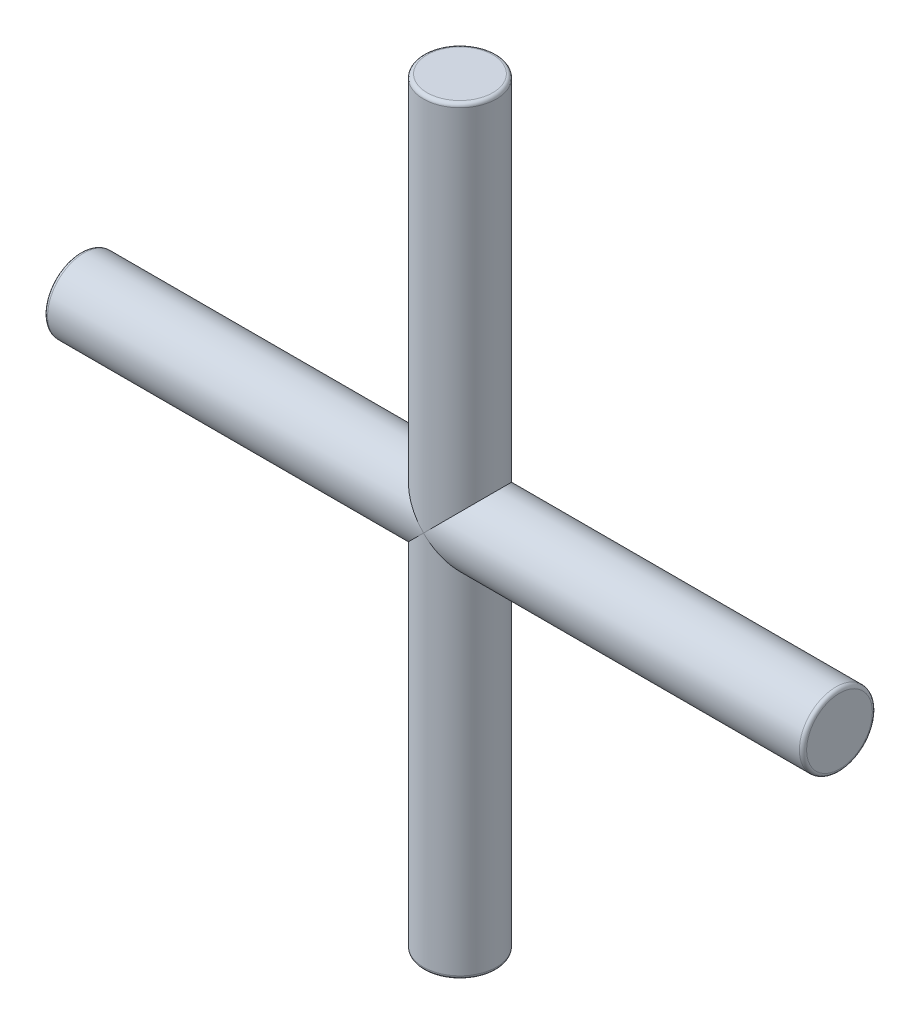
ISO-10303-21;
HEADER;
FILE_DESCRIPTION(('STEP AP214'),'2;1');
FILE_NAME('part.step','',(''),(''),'','','');
FILE_SCHEMA(('AUTOMOTIVE_DESIGN { 1 0 10303 214 1 1 1 1 }'));
ENDSEC;
DATA;
#1=APPLICATION_CONTEXT('core data for automotive mechanical design processes');
#2=APPLICATION_PROTOCOL_DEFINITION('international standard','automotive_design',2000,#1);
#3=PRODUCT_CONTEXT('',#1,'mechanical');
#4=PRODUCT('Part','Part','',(#3));
#5=PRODUCT_RELATED_PRODUCT_CATEGORY('part','',(#4));
#6=PRODUCT_DEFINITION_FORMATION('','',#4);
#7=PRODUCT_DEFINITION_CONTEXT('part definition',#1,'design');
#8=PRODUCT_DEFINITION('design','',#6,#7);
#9=PRODUCT_DEFINITION_SHAPE('','',#8);
#10=(LENGTH_UNIT() NAMED_UNIT(*) SI_UNIT(.MILLI.,.METRE.));
#11=(NAMED_UNIT(*) PLANE_ANGLE_UNIT() SI_UNIT($,.RADIAN.));
#12=(NAMED_UNIT(*) SI_UNIT($,.STERADIAN.) SOLID_ANGLE_UNIT());
#13=UNCERTAINTY_MEASURE_WITH_UNIT(LENGTH_MEASURE(1.E-05),#10,'distance_accuracy_value','');
#14=(GEOMETRIC_REPRESENTATION_CONTEXT(3) GLOBAL_UNCERTAINTY_ASSIGNED_CONTEXT((#13)) GLOBAL_UNIT_ASSIGNED_CONTEXT((#10,
#11,#12)) REPRESENTATION_CONTEXT('',''));
#15=CARTESIAN_POINT('',(0.,0.,0.));
#16=DIRECTION('',(0.,0.,1.));
#17=DIRECTION('',(1.,0.,0.));
#18=AXIS2_PLACEMENT_3D('',#15,#16,#17);
#19=CARTESIAN_POINT('',(26000.,0.,0.));
#20=DIRECTION('',(-1.,0.,0.));
#21=DIRECTION('',(0.,0.,1.));
#22=AXIS2_PLACEMENT_3D('',#19,#20,#21);
#23=CYLINDRICAL_SURFACE('',#22,2500.);
#24=CARTESIAN_POINT('',(25750.,0.,0.));
#25=DIRECTION('',(1.,0.,0.));
#26=DIRECTION('',(0.,0.,-1.));
#27=AXIS2_PLACEMENT_3D('',#24,#25,#26);
#28=CIRCLE('',#27,2500.);
#29=CARTESIAN_POINT('',(25750.,0.,-2500.));
#30=VERTEX_POINT('',#29);
#31=EDGE_CURVE('E72',#30,#30,#28,.F.);
#32=ORIENTED_EDGE('',*,*,#31,.T.);
#33=EDGE_LOOP('',(#32));
#34=FACE_BOUND('',#33,.T.);
#35=CARTESIAN_POINT('',(0.,0.,0.));
#36=DIRECTION('',(-0.707106781186547,-0.707106781186547,0.));
#37=DIRECTION('',(-0.707106781186547,0.707106781186547,0.));
#38=AXIS2_PLACEMENT_3D('',#35,#36,#37);
#39=ELLIPSE('',#38,3535.53390593274,2500.);
#40=CARTESIAN_POINT('',(0.,0.,-2500.));
#41=VERTEX_POINT('',#40);
#42=CARTESIAN_POINT('',(0.,0.,2500.));
#43=VERTEX_POINT('',#42);
#44=EDGE_CURVE('E58',#41,#43,#39,.T.);
#45=ORIENTED_EDGE('',*,*,#44,.F.);
#46=CARTESIAN_POINT('',(0.,0.,0.));
#47=DIRECTION('',(-0.707106781186547,0.707106781186547,0.));
#48=DIRECTION('',(-0.707106781186547,-0.707106781186547,0.));
#49=AXIS2_PLACEMENT_3D('',#46,#47,#48);
#50=ELLIPSE('',#49,3535.53390593274,2500.);
#51=EDGE_CURVE('E57',#43,#41,#50,.T.);
#52=ORIENTED_EDGE('',*,*,#51,.F.);
#53=EDGE_LOOP('',(#45,#52));
#54=FACE_BOUND('',#53,.T.);
#55=ADVANCED_FACE('F37',(#34,#54),#23,.T.);
#56=CARTESIAN_POINT('',(26000.,0.,0.));
#57=DIRECTION('',(1.,0.,0.));
#58=DIRECTION('',(0.,0.,-1.));
#59=AXIS2_PLACEMENT_3D('',#56,#57,#58);
#60=PLANE('',#59);
#61=CARTESIAN_POINT('',(26000.,0.,0.));
#62=DIRECTION('',(1.,0.,0.));
#63=DIRECTION('',(0.,0.,-1.));
#64=AXIS2_PLACEMENT_3D('',#61,#62,#63);
#65=CIRCLE('',#64,2250.);
#66=CARTESIAN_POINT('',(26000.,0.,-2250.));
#67=VERTEX_POINT('',#66);
#68=EDGE_CURVE('E69',#67,#67,#65,.T.);
#69=ORIENTED_EDGE('',*,*,#68,.T.);
#70=EDGE_LOOP('',(#69));
#71=FACE_BOUND('',#70,.T.);
#72=ADVANCED_FACE('F103',(#71),#60,.T.);
#73=CARTESIAN_POINT('',(0.,-26000.,0.));
#74=DIRECTION('',(0.,1.,0.));
#75=DIRECTION('',(0.,0.,1.));
#76=AXIS2_PLACEMENT_3D('',#73,#74,#75);
#77=PLANE('',#76);
#78=CARTESIAN_POINT('',(0.,-26000.,0.));
#79=DIRECTION('',(0.,1.,0.));
#80=DIRECTION('',(0.,0.,1.));
#81=AXIS2_PLACEMENT_3D('',#78,#79,#80);
#82=CIRCLE('',#81,2250.);
#83=CARTESIAN_POINT('',(0.,-26000.,2250.));
#84=VERTEX_POINT('',#83);
#85=EDGE_CURVE('E86',#84,#84,#82,.F.);
#86=ORIENTED_EDGE('',*,*,#85,.T.);
#87=EDGE_LOOP('',(#86));
#88=FACE_BOUND('',#87,.T.);
#89=ADVANCED_FACE('F109',(#88),#77,.F.);
#90=CARTESIAN_POINT('',(0.,26000.,0.));
#91=DIRECTION('',(0.,-1.,0.));
#92=DIRECTION('',(0.,0.,-1.));
#93=AXIS2_PLACEMENT_3D('',#90,#91,#92);
#94=CYLINDRICAL_SURFACE('',#93,2500.);
#95=CARTESIAN_POINT('',(0.,-25750.,0.));
#96=DIRECTION('',(0.,1.,0.));
#97=DIRECTION('',(0.,0.,1.));
#98=AXIS2_PLACEMENT_3D('',#95,#96,#97);
#99=CIRCLE('',#98,2500.);
#100=CARTESIAN_POINT('',(0.,-25750.,2500.));
#101=VERTEX_POINT('',#100);
#102=EDGE_CURVE('E83',#101,#101,#99,.T.);
#103=ORIENTED_EDGE('',*,*,#102,.T.);
#104=EDGE_LOOP('',(#103));
#105=FACE_BOUND('',#104,.T.);
#106=CARTESIAN_POINT('',(0.,0.,0.));
#107=DIRECTION('',(-0.707106781186547,0.707106781186547,0.));
#108=DIRECTION('',(-0.707106781186547,-0.707106781186547,0.));
#109=AXIS2_PLACEMENT_3D('',#106,#107,#108);
#110=ELLIPSE('',#109,3535.53390593274,2500.);
#111=EDGE_CURVE('E51',#43,#41,#110,.F.);
#112=ORIENTED_EDGE('',*,*,#111,.T.);
#113=ORIENTED_EDGE('',*,*,#44,.T.);
#114=EDGE_LOOP('',(#112,#113));
#115=FACE_BOUND('',#114,.T.);
#116=ADVANCED_FACE('F66',(#105,#115),#94,.T.);
#117=CARTESIAN_POINT('',(-26000.,0.,0.));
#118=DIRECTION('',(1.,0.,0.));
#119=DIRECTION('',(0.,0.,-1.));
#120=AXIS2_PLACEMENT_3D('',#117,#118,#119);
#121=PLANE('',#120);
#122=CARTESIAN_POINT('',(-26000.,0.,0.));
#123=DIRECTION('',(1.,0.,0.));
#124=DIRECTION('',(0.,0.,-1.));
#125=AXIS2_PLACEMENT_3D('',#122,#123,#124);
#126=CIRCLE('',#125,2250.);
#127=CARTESIAN_POINT('',(-26000.,0.,-2250.));
#128=VERTEX_POINT('',#127);
#129=EDGE_CURVE('E80',#128,#128,#126,.F.);
#130=ORIENTED_EDGE('',*,*,#129,.T.);
#131=EDGE_LOOP('',(#130));
#132=FACE_BOUND('',#131,.T.);
#133=ADVANCED_FACE('F115',(#132),#121,.F.);
#134=CARTESIAN_POINT('',(-25750.,0.,0.));
#135=DIRECTION('',(1.,0.,0.));
#136=DIRECTION('',(0.,0.,-1.));
#137=AXIS2_PLACEMENT_3D('',#134,#135,#136);
#138=CIRCLE('',#137,2500.);
#139=CARTESIAN_POINT('',(-25750.,0.,-2500.));
#140=VERTEX_POINT('',#139);
#141=EDGE_CURVE('E77',#140,#140,#138,.T.);
#142=ORIENTED_EDGE('',*,*,#141,.T.);
#143=EDGE_LOOP('',(#142));
#144=FACE_BOUND('',#143,.T.);
#145=CARTESIAN_POINT('',(0.,0.,0.));
#146=DIRECTION('',(-0.707106781186547,-0.707106781186547,0.));
#147=DIRECTION('',(-0.707106781186547,0.707106781186547,0.));
#148=AXIS2_PLACEMENT_3D('',#145,#146,#147);
#149=ELLIPSE('',#148,3535.53390593274,2500.);
#150=EDGE_CURVE('E64',#41,#43,#149,.F.);
#151=ORIENTED_EDGE('',*,*,#150,.F.);
#152=ORIENTED_EDGE('',*,*,#111,.F.);
#153=EDGE_LOOP('',(#151,#152));
#154=FACE_BOUND('',#153,.T.);
#155=ADVANCED_FACE('F63',(#144,#154),#23,.T.);
#156=CARTESIAN_POINT('',(0.,25750.,0.));
#157=DIRECTION('',(0.,1.,0.));
#158=DIRECTION('',(0.,0.,1.));
#159=AXIS2_PLACEMENT_3D('',#156,#157,#158);
#160=CIRCLE('',#159,2500.);
#161=CARTESIAN_POINT('',(0.,25750.,2500.));
#162=VERTEX_POINT('',#161);
#163=EDGE_CURVE('E11',#162,#162,#160,.F.);
#164=ORIENTED_EDGE('',*,*,#163,.T.);
#165=EDGE_LOOP('',(#164));
#166=FACE_BOUND('',#165,.T.);
#167=ORIENTED_EDGE('',*,*,#51,.T.);
#168=ORIENTED_EDGE('',*,*,#150,.T.);
#169=EDGE_LOOP('',(#167,#168));
#170=FACE_BOUND('',#169,.T.);
#171=ADVANCED_FACE('F68',(#166,#170),#94,.T.);
#172=CARTESIAN_POINT('',(0.,26000.,0.));
#173=DIRECTION('',(0.,1.,0.));
#174=DIRECTION('',(0.,0.,1.));
#175=AXIS2_PLACEMENT_3D('',#172,#173,#174);
#176=PLANE('',#175);
#177=CARTESIAN_POINT('',(0.,26000.,0.));
#178=DIRECTION('',(0.,1.,0.));
#179=DIRECTION('',(0.,0.,1.));
#180=AXIS2_PLACEMENT_3D('',#177,#178,#179);
#181=CIRCLE('',#180,2250.);
#182=CARTESIAN_POINT('',(0.,26000.,2250.));
#183=VERTEX_POINT('',#182);
#184=EDGE_CURVE('E45',#183,#183,#181,.T.);
#185=ORIENTED_EDGE('',*,*,#184,.T.);
#186=EDGE_LOOP('',(#185));
#187=FACE_BOUND('',#186,.T.);
#188=ADVANCED_FACE('F91',(#187),#176,.T.);
#189=CARTESIAN_POINT('',(25750.,0.,0.));
#190=DIRECTION('',(1.,0.,0.));
#191=DIRECTION('',(0.,0.,-1.));
#192=AXIS2_PLACEMENT_3D('',#189,#190,#191);
#193=TOROIDAL_SURFACE('',#192,2250.,250.);
#194=ORIENTED_EDGE('',*,*,#31,.F.);
#195=EDGE_LOOP('',(#194));
#196=FACE_BOUND('',#195,.T.);
#197=ORIENTED_EDGE('',*,*,#68,.F.);
#198=EDGE_LOOP('',(#197));
#199=FACE_BOUND('',#198,.T.);
#200=ADVANCED_FACE('F127',(#196,#199),#193,.T.);
#201=CARTESIAN_POINT('',(-25750.,0.,0.));
#202=DIRECTION('',(1.,0.,0.));
#203=DIRECTION('',(0.,0.,-1.));
#204=AXIS2_PLACEMENT_3D('',#201,#202,#203);
#205=TOROIDAL_SURFACE('',#204,2250.,250.);
#206=ORIENTED_EDGE('',*,*,#129,.F.);
#207=EDGE_LOOP('',(#206));
#208=FACE_BOUND('',#207,.T.);
#209=ORIENTED_EDGE('',*,*,#141,.F.);
#210=EDGE_LOOP('',(#209));
#211=FACE_BOUND('',#210,.T.);
#212=ADVANCED_FACE('F99',(#208,#211),#205,.T.);
#213=CARTESIAN_POINT('',(0.,-25750.,0.));
#214=DIRECTION('',(0.,1.,0.));
#215=DIRECTION('',(0.,0.,1.));
#216=AXIS2_PLACEMENT_3D('',#213,#214,#215);
#217=TOROIDAL_SURFACE('',#216,2250.,250.);
#218=ORIENTED_EDGE('',*,*,#85,.F.);
#219=EDGE_LOOP('',(#218));
#220=FACE_BOUND('',#219,.T.);
#221=ORIENTED_EDGE('',*,*,#102,.F.);
#222=EDGE_LOOP('',(#221));
#223=FACE_BOUND('',#222,.T.);
#224=ADVANCED_FACE('F94',(#220,#223),#217,.T.);
#225=CARTESIAN_POINT('',(0.,25750.,0.));
#226=DIRECTION('',(0.,1.,0.));
#227=DIRECTION('',(0.,0.,1.));
#228=AXIS2_PLACEMENT_3D('',#225,#226,#227);
#229=TOROIDAL_SURFACE('',#228,2250.,250.);
#230=ORIENTED_EDGE('',*,*,#163,.F.);
#231=EDGE_LOOP('',(#230));
#232=FACE_BOUND('',#231,.T.);
#233=ORIENTED_EDGE('',*,*,#184,.F.);
#234=EDGE_LOOP('',(#233));
#235=FACE_BOUND('',#234,.T.);
#236=ADVANCED_FACE('F39',(#232,#235),#229,.T.);
#237=CLOSED_SHELL('',(#55,#72,#89,#116,#133,#155,#171,#188,#200,#212,#224,#236));
#238=MANIFOLD_SOLID_BREP('B2',#237);
#239=ADVANCED_BREP_SHAPE_REPRESENTATION('',(#18,#238),#14);
#240=SHAPE_DEFINITION_REPRESENTATION(#9,#239);
ENDSEC;
END-ISO-10303-21;
